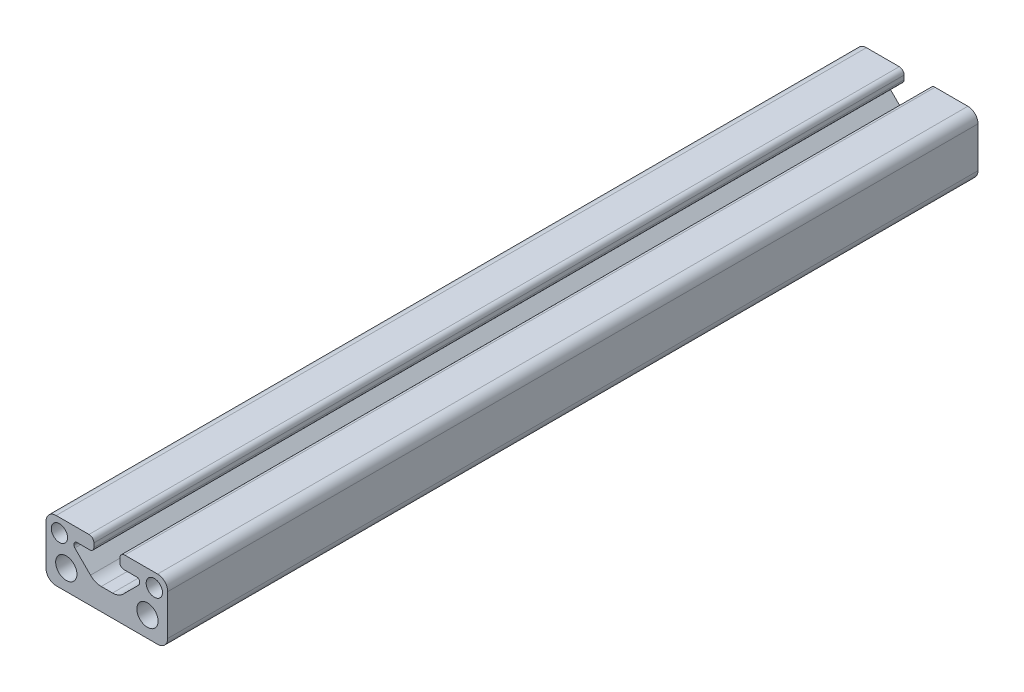
ISO-10303-21;
HEADER;
FILE_DESCRIPTION(('STEP AP214'),'2;1');
FILE_NAME('part.step','',(''),(''),'','','');
FILE_SCHEMA(('AUTOMOTIVE_DESIGN { 1 0 10303 214 1 1 1 1 }'));
ENDSEC;
DATA;
#1=APPLICATION_CONTEXT('core data for automotive mechanical design processes');
#2=APPLICATION_PROTOCOL_DEFINITION('international standard','automotive_design',2000,#1);
#3=PRODUCT_CONTEXT('',#1,'mechanical');
#4=PRODUCT('Part','Part','',(#3));
#5=PRODUCT_RELATED_PRODUCT_CATEGORY('part','',(#4));
#6=PRODUCT_DEFINITION_FORMATION('','',#4);
#7=PRODUCT_DEFINITION_CONTEXT('part definition',#1,'design');
#8=PRODUCT_DEFINITION('design','',#6,#7);
#9=PRODUCT_DEFINITION_SHAPE('','',#8);
#10=(LENGTH_UNIT() NAMED_UNIT(*) SI_UNIT(.MILLI.,.METRE.));
#11=(NAMED_UNIT(*) PLANE_ANGLE_UNIT() SI_UNIT($,.RADIAN.));
#12=(NAMED_UNIT(*) SI_UNIT($,.STERADIAN.) SOLID_ANGLE_UNIT());
#13=UNCERTAINTY_MEASURE_WITH_UNIT(LENGTH_MEASURE(1.E-05),#10,'distance_accuracy_value','');
#14=(GEOMETRIC_REPRESENTATION_CONTEXT(3) GLOBAL_UNCERTAINTY_ASSIGNED_CONTEXT((#13)) GLOBAL_UNIT_ASSIGNED_CONTEXT((#10,
#11,#12)) REPRESENTATION_CONTEXT('',''));
#15=CARTESIAN_POINT('',(0.,0.,0.));
#16=DIRECTION('',(0.,0.,1.));
#17=DIRECTION('',(1.,0.,0.));
#18=AXIS2_PLACEMENT_3D('',#15,#16,#17);
#19=CARTESIAN_POINT('',(-9.39800000000002,4.25536498708179,126.785));
#20=DIRECTION('',(0.,0.,1.));
#21=DIRECTION('',(1.,0.,0.));
#22=AXIS2_PLACEMENT_3D('',#19,#20,#21);
#23=PLANE('',#22);
#24=CARTESIAN_POINT('',(12.7,-3.175,126.785));
#25=DIRECTION('',(0.,0.,1.));
#26=DIRECTION('',(1.,0.,0.));
#27=AXIS2_PLACEMENT_3D('',#24,#25,#26);
#28=CIRCLE('',#27,3.32739999999998);
#29=CARTESIAN_POINT('',(16.0274,-3.175,126.785));
#30=VERTEX_POINT('',#29);
#31=EDGE_CURVE('E498',#30,#30,#28,.T.);
#32=ORIENTED_EDGE('',*,*,#31,.F.);
#33=EDGE_LOOP('',(#32));
#34=FACE_BOUND('',#33,.T.);
#35=CARTESIAN_POINT('',(-14.8487969585205,5.2764327733935,126.785));
#36=DIRECTION('',(0.,0.,1.));
#37=DIRECTION('',(1.,0.,0.));
#38=AXIS2_PLACEMENT_3D('',#35,#36,#37);
#39=CIRCLE('',#38,2.55270000000001);
#40=CARTESIAN_POINT('',(-12.2960969585205,5.2764327733935,126.785));
#41=VERTEX_POINT('',#40);
#42=EDGE_CURVE('E253',#41,#41,#39,.T.);
#43=ORIENTED_EDGE('',*,*,#42,.F.);
#44=EDGE_LOOP('',(#43));
#45=FACE_BOUND('',#44,.T.);
#46=CARTESIAN_POINT('',(-9.39800000000002,4.25536498708179,126.785));
#47=DIRECTION('',(0.,0.,-1.));
#48=DIRECTION('',(1.,0.,0.));
#49=AXIS2_PLACEMENT_3D('',#46,#47,#48);
#50=CIRCLE('',#49,0.888999999999977);
#51=CARTESIAN_POINT('',(-10.0266179284749,3.62674705860696,126.785));
#52=VERTEX_POINT('',#51);
#53=CARTESIAN_POINT('',(-10.287,4.25536498708178,126.785));
#54=VERTEX_POINT('',#53);
#55=EDGE_CURVE('E304',#52,#54,#50,.T.);
#56=ORIENTED_EDGE('',*,*,#55,.T.);
#57=DIRECTION('',(0.,1.,0.));
#58=VECTOR('',#57,1.);
#59=CARTESIAN_POINT('',(-10.287,4.25536498708178,126.785));
#60=LINE('',#59,#58);
#61=CARTESIAN_POINT('',(-10.287,4.5719999999999,126.785));
#62=VERTEX_POINT('',#61);
#63=EDGE_CURVE('E152',#54,#62,#60,.T.);
#64=ORIENTED_EDGE('',*,*,#63,.T.);
#65=CARTESIAN_POINT('',(-9.398,4.5719999999999,126.785));
#66=DIRECTION('',(0.,0.,-1.));
#67=DIRECTION('',(1.,0.,0.));
#68=AXIS2_PLACEMENT_3D('',#65,#66,#67);
#69=CIRCLE('',#68,0.888999999999999);
#70=CARTESIAN_POINT('',(-9.398,5.4609999999999,126.785));
#71=VERTEX_POINT('',#70);
#72=EDGE_CURVE('E379',#62,#71,#69,.T.);
#73=ORIENTED_EDGE('',*,*,#72,.T.);
#74=DIRECTION('',(1.,0.,0.));
#75=VECTOR('',#74,1.);
#76=CARTESIAN_POINT('',(-9.398,5.4609999999999,126.785));
#77=LINE('',#76,#75);
#78=CARTESIAN_POINT('',(-5.334,5.4609999999999,126.785));
#79=VERTEX_POINT('',#78);
#80=EDGE_CURVE('E398',#71,#79,#77,.T.);
#81=ORIENTED_EDGE('',*,*,#80,.T.);
#82=CARTESIAN_POINT('',(-5.334,6.7309999999999,126.785));
#83=DIRECTION('',(0.,0.,1.));
#84=DIRECTION('',(1.,0.,0.));
#85=AXIS2_PLACEMENT_3D('',#82,#83,#84);
#86=CIRCLE('',#85,1.27);
#87=CARTESIAN_POINT('',(-4.064,6.7309999999999,126.785));
#88=VERTEX_POINT('',#87);
#89=EDGE_CURVE('E395',#79,#88,#86,.T.);
#90=ORIENTED_EDGE('',*,*,#89,.T.);
#91=DIRECTION('',(0.,1.,0.));
#92=VECTOR('',#91,1.);
#93=CARTESIAN_POINT('',(-4.064,6.7309999999999,126.785));
#94=LINE('',#93,#92);
#95=CARTESIAN_POINT('',(-4.06399999999996,8.00099999999999,126.785));
#96=VERTEX_POINT('',#95);
#97=EDGE_CURVE('E397',#88,#96,#94,.T.);
#98=ORIENTED_EDGE('',*,*,#97,.T.);
#99=CARTESIAN_POINT('',(-5.58799999999999,8.00099999999999,126.785));
#100=DIRECTION('',(0.,0.,1.));
#101=DIRECTION('',(1.,0.,0.));
#102=AXIS2_PLACEMENT_3D('',#99,#100,#101);
#103=CIRCLE('',#102,1.52400000000005);
#104=CARTESIAN_POINT('',(-5.58799999999999,9.52500000000004,126.785));
#105=VERTEX_POINT('',#104);
#106=EDGE_CURVE('E400',#96,#105,#103,.T.);
#107=ORIENTED_EDGE('',*,*,#106,.T.);
#108=DIRECTION('',(-1.,0.,0.));
#109=VECTOR('',#108,1.);
#110=CARTESIAN_POINT('',(-5.58799999999999,9.52500000000006,126.785));
#111=LINE('',#110,#109);
#112=CARTESIAN_POINT('',(-15.875,9.52499999999998,126.785));
#113=VERTEX_POINT('',#112);
#114=EDGE_CURVE('E406',#105,#113,#111,.T.);
#115=ORIENTED_EDGE('',*,*,#114,.T.);
#116=CARTESIAN_POINT('',(-15.875,6.34999999999999,126.785));
#117=DIRECTION('',(0.,0.,1.));
#118=DIRECTION('',(1.,0.,0.));
#119=AXIS2_PLACEMENT_3D('',#116,#117,#118);
#120=CIRCLE('',#119,3.175);
#121=CARTESIAN_POINT('',(-19.05,6.34999999999999,126.785));
#122=VERTEX_POINT('',#121);
#123=EDGE_CURVE('E408',#113,#122,#120,.T.);
#124=ORIENTED_EDGE('',*,*,#123,.T.);
#125=DIRECTION('',(0.,-1.,0.));
#126=VECTOR('',#125,1.);
#127=CARTESIAN_POINT('',(-19.05,6.34999999999999,126.785));
#128=LINE('',#127,#126);
#129=CARTESIAN_POINT('',(-19.05,-6.35000000000002,126.785));
#130=VERTEX_POINT('',#129);
#131=EDGE_CURVE('E410',#122,#130,#128,.T.);
#132=ORIENTED_EDGE('',*,*,#131,.T.);
#133=CARTESIAN_POINT('',(-15.875,-6.35000000000002,126.785));
#134=DIRECTION('',(0.,0.,1.));
#135=DIRECTION('',(1.,0.,0.));
#136=AXIS2_PLACEMENT_3D('',#133,#134,#135);
#137=CIRCLE('',#136,3.175);
#138=CARTESIAN_POINT('',(-15.875,-9.52500000000001,126.785));
#139=VERTEX_POINT('',#138);
#140=EDGE_CURVE('E412',#130,#139,#137,.T.);
#141=ORIENTED_EDGE('',*,*,#140,.T.);
#142=DIRECTION('',(1.,0.,0.));
#143=VECTOR('',#142,1.);
#144=CARTESIAN_POINT('',(-15.875,-9.52500000000001,126.785));
#145=LINE('',#144,#143);
#146=CARTESIAN_POINT('',(15.875,-9.52500000000002,126.785));
#147=VERTEX_POINT('',#146);
#148=EDGE_CURVE('E414',#139,#147,#145,.T.);
#149=ORIENTED_EDGE('',*,*,#148,.T.);
#150=CARTESIAN_POINT('',(15.875,-6.35000000000002,126.785));
#151=DIRECTION('',(0.,0.,1.));
#152=DIRECTION('',(1.,0.,0.));
#153=AXIS2_PLACEMENT_3D('',#150,#151,#152);
#154=CIRCLE('',#153,3.175);
#155=CARTESIAN_POINT('',(19.05,-6.35000000000002,126.785));
#156=VERTEX_POINT('',#155);
#157=EDGE_CURVE('E416',#147,#156,#154,.T.);
#158=ORIENTED_EDGE('',*,*,#157,.T.);
#159=DIRECTION('',(0.,1.,0.));
#160=VECTOR('',#159,1.);
#161=CARTESIAN_POINT('',(19.05,-6.35000000000002,126.785));
#162=LINE('',#161,#160);
#163=CARTESIAN_POINT('',(19.05,6.34999999999998,126.785));
#164=VERTEX_POINT('',#163);
#165=EDGE_CURVE('E418',#156,#164,#162,.T.);
#166=ORIENTED_EDGE('',*,*,#165,.T.);
#167=CARTESIAN_POINT('',(15.875,6.34999999999998,126.785));
#168=DIRECTION('',(0.,0.,1.));
#169=DIRECTION('',(1.,0.,0.));
#170=AXIS2_PLACEMENT_3D('',#167,#168,#169);
#171=CIRCLE('',#170,3.175);
#172=CARTESIAN_POINT('',(15.875,9.52499999999999,126.785));
#173=VERTEX_POINT('',#172);
#174=EDGE_CURVE('E420',#164,#173,#171,.T.);
#175=ORIENTED_EDGE('',*,*,#174,.T.);
#176=DIRECTION('',(-1.,0.,0.));
#177=VECTOR('',#176,1.);
#178=CARTESIAN_POINT('',(15.875,9.52499999999999,126.785));
#179=LINE('',#178,#177);
#180=CARTESIAN_POINT('',(5.58799999999998,9.52499999999999,126.785));
#181=VERTEX_POINT('',#180);
#182=EDGE_CURVE('E422',#173,#181,#179,.T.);
#183=ORIENTED_EDGE('',*,*,#182,.T.);
#184=CARTESIAN_POINT('',(5.58799999999998,8.00100000000001,126.785));
#185=DIRECTION('',(0.,0.,1.));
#186=DIRECTION('',(1.,0.,0.));
#187=AXIS2_PLACEMENT_3D('',#184,#185,#186);
#188=CIRCLE('',#187,1.52399999999998);
#189=CARTESIAN_POINT('',(4.064,8.00100000000001,126.785));
#190=VERTEX_POINT('',#189);
#191=EDGE_CURVE('E424',#181,#190,#188,.T.);
#192=ORIENTED_EDGE('',*,*,#191,.T.);
#193=DIRECTION('',(0.,-1.,0.));
#194=VECTOR('',#193,1.);
#195=CARTESIAN_POINT('',(4.064,8.00100000000001,126.785));
#196=LINE('',#195,#194);
#197=CARTESIAN_POINT('',(4.064,6.73099999999988,126.785));
#198=VERTEX_POINT('',#197);
#199=EDGE_CURVE('E426',#190,#198,#196,.T.);
#200=ORIENTED_EDGE('',*,*,#199,.T.);
#201=CARTESIAN_POINT('',(5.33399999999998,6.73099999999988,126.785));
#202=DIRECTION('',(0.,0.,1.));
#203=DIRECTION('',(1.,0.,0.));
#204=AXIS2_PLACEMENT_3D('',#201,#202,#203);
#205=CIRCLE('',#204,1.26999999999998);
#206=CARTESIAN_POINT('',(5.33399999999998,5.4609999999999,126.785));
#207=VERTEX_POINT('',#206);
#208=EDGE_CURVE('E428',#198,#207,#205,.T.);
#209=ORIENTED_EDGE('',*,*,#208,.T.);
#210=DIRECTION('',(1.,0.,0.));
#211=VECTOR('',#210,1.);
#212=CARTESIAN_POINT('',(5.33399999999998,5.4609999999999,126.785));
#213=LINE('',#212,#211);
#214=CARTESIAN_POINT('',(9.398,5.4609999999999,126.785));
#215=VERTEX_POINT('',#214);
#216=EDGE_CURVE('E430',#207,#215,#213,.T.);
#217=ORIENTED_EDGE('',*,*,#216,.T.);
#218=CARTESIAN_POINT('',(9.398,4.5719999999999,126.785));
#219=DIRECTION('',(0.,0.,-1.));
#220=DIRECTION('',(1.,0.,0.));
#221=AXIS2_PLACEMENT_3D('',#218,#219,#220);
#222=CIRCLE('',#221,0.888999999999999);
#223=CARTESIAN_POINT('',(10.287,4.5719999999999,126.785));
#224=VERTEX_POINT('',#223);
#225=EDGE_CURVE('E432',#215,#224,#222,.T.);
#226=ORIENTED_EDGE('',*,*,#225,.T.);
#227=DIRECTION('',(0.,-1.,0.));
#228=VECTOR('',#227,1.);
#229=CARTESIAN_POINT('',(10.287,4.5719999999999,126.785));
#230=LINE('',#229,#228);
#231=CARTESIAN_POINT('',(10.287,4.25536498708178,126.785));
#232=VERTEX_POINT('',#231);
#233=EDGE_CURVE('E434',#224,#232,#230,.T.);
#234=ORIENTED_EDGE('',*,*,#233,.T.);
#235=CARTESIAN_POINT('',(9.39800000000002,4.25536498708179,126.785));
#236=DIRECTION('',(0.,0.,-1.));
#237=DIRECTION('',(1.,0.,0.));
#238=AXIS2_PLACEMENT_3D('',#235,#236,#237);
#239=CIRCLE('',#238,0.888999999999977);
#240=CARTESIAN_POINT('',(10.0266179284748,3.62674705860696,126.785));
#241=VERTEX_POINT('',#240);
#242=EDGE_CURVE('E436',#232,#241,#239,.T.);
#243=ORIENTED_EDGE('',*,*,#242,.T.);
#244=DIRECTION('',(-0.707106781186548,-0.707106781186548,0.));
#245=VECTOR('',#244,1.);
#246=CARTESIAN_POINT('',(10.0266179284748,3.62674705860696,126.785));
#247=LINE('',#246,#245);
#248=CARTESIAN_POINT('',(5.12405508058801,-1.27581578927987,126.785));
#249=VERTEX_POINT('',#248);
#250=EDGE_CURVE('E438',#241,#249,#247,.T.);
#251=ORIENTED_EDGE('',*,*,#250,.T.);
#252=CARTESIAN_POINT('',(1.76543929130814,2.0828,126.785));
#253=DIRECTION('',(0.,0.,-1.));
#254=DIRECTION('',(1.,0.,0.));
#255=AXIS2_PLACEMENT_3D('',#252,#253,#254);
#256=CIRCLE('',#255,4.74980000000002);
#257=CARTESIAN_POINT('',(1.76543929130813,-2.66700000000002,126.785));
#258=VERTEX_POINT('',#257);
#259=EDGE_CURVE('E231',#249,#258,#256,.T.);
#260=ORIENTED_EDGE('',*,*,#259,.T.);
#261=DIRECTION('',(-1.,0.,0.));
#262=VECTOR('',#261,1.);
#263=CARTESIAN_POINT('',(1.76543929130814,-2.66700000000002,126.785));
#264=LINE('',#263,#262);
#265=CARTESIAN_POINT('',(-1.76543929130814,-2.66700000000002,126.785));
#266=VERTEX_POINT('',#265);
#267=EDGE_CURVE('E225',#258,#266,#264,.T.);
#268=ORIENTED_EDGE('',*,*,#267,.T.);
#269=CARTESIAN_POINT('',(-1.76543929130814,2.0828,126.785));
#270=DIRECTION('',(0.,0.,-1.));
#271=DIRECTION('',(1.,0.,0.));
#272=AXIS2_PLACEMENT_3D('',#269,#270,#271);
#273=CIRCLE('',#272,4.74980000000002);
#274=CARTESIAN_POINT('',(-5.12405508058801,-1.27581578927987,126.785));
#275=VERTEX_POINT('',#274);
#276=EDGE_CURVE('E229',#266,#275,#273,.T.);
#277=ORIENTED_EDGE('',*,*,#276,.T.);
#278=DIRECTION('',(-0.707106781186548,0.707106781186547,0.));
#279=VECTOR('',#278,1.);
#280=CARTESIAN_POINT('',(-5.12405508058801,-1.27581578927987,126.785));
#281=LINE('',#280,#279);
#282=EDGE_CURVE('E49',#275,#52,#281,.T.);
#283=ORIENTED_EDGE('',*,*,#282,.T.);
#284=EDGE_LOOP('',(#56,#64,#73,#81,#90,#98,#107,#115,#124,#132,#141,#149,#158,#166,#175,#183,
#192,#200,#209,#217,#226,#234,#243,#251,#260,#268,#277,#283));
#285=FACE_BOUND('',#284,.T.);
#286=CARTESIAN_POINT('',(-12.7,-3.175,126.785));
#287=DIRECTION('',(0.,0.,1.));
#288=DIRECTION('',(1.,0.,0.));
#289=AXIS2_PLACEMENT_3D('',#286,#287,#288);
#290=CIRCLE('',#289,3.3274);
#291=CARTESIAN_POINT('',(-9.37260000000001,-3.175,126.785));
#292=VERTEX_POINT('',#291);
#293=EDGE_CURVE('E504',#292,#292,#290,.T.);
#294=ORIENTED_EDGE('',*,*,#293,.F.);
#295=EDGE_LOOP('',(#294));
#296=FACE_BOUND('',#295,.T.);
#297=CARTESIAN_POINT('',(14.8487969585206,5.27643277339342,126.785));
#298=DIRECTION('',(0.,0.,1.));
#299=DIRECTION('',(1.,0.,0.));
#300=AXIS2_PLACEMENT_3D('',#297,#298,#299);
#301=CIRCLE('',#300,2.55270000000001);
#302=CARTESIAN_POINT('',(17.4014969585206,5.27643277339342,126.785));
#303=VERTEX_POINT('',#302);
#304=EDGE_CURVE('E489',#303,#303,#301,.T.);
#305=ORIENTED_EDGE('',*,*,#304,.F.);
#306=EDGE_LOOP('',(#305));
#307=FACE_BOUND('',#306,.T.);
#308=ADVANCED_FACE('F32',(#34,#45,#285,#296,#307),#23,.T.);
#309=CARTESIAN_POINT('',(-9.39800000000002,4.25536498708179,-126.785));
#310=DIRECTION('',(0.,0.,1.));
#311=DIRECTION('',(1.,0.,0.));
#312=AXIS2_PLACEMENT_3D('',#309,#310,#311);
#313=PLANE('',#312);
#314=CARTESIAN_POINT('',(-9.39800000000002,4.25536498708179,-126.785));
#315=DIRECTION('',(0.,0.,-1.));
#316=DIRECTION('',(1.,0.,0.));
#317=AXIS2_PLACEMENT_3D('',#314,#315,#316);
#318=CIRCLE('',#317,0.888999999999977);
#319=CARTESIAN_POINT('',(-10.0266179284749,3.62674705860696,-126.785));
#320=VERTEX_POINT('',#319);
#321=CARTESIAN_POINT('',(-10.287,4.25536498708178,-126.785));
#322=VERTEX_POINT('',#321);
#323=EDGE_CURVE('E249',#320,#322,#318,.T.);
#324=ORIENTED_EDGE('',*,*,#323,.F.);
#325=DIRECTION('',(-0.707106781186548,0.707106781186547,0.));
#326=VECTOR('',#325,1.);
#327=CARTESIAN_POINT('',(-5.12405508058801,-1.27581578927987,-126.785));
#328=LINE('',#327,#326);
#329=CARTESIAN_POINT('',(-5.12405508058801,-1.27581578927987,-126.785));
#330=VERTEX_POINT('',#329);
#331=EDGE_CURVE('E144',#330,#320,#328,.T.);
#332=ORIENTED_EDGE('',*,*,#331,.F.);
#333=CARTESIAN_POINT('',(-1.76543929130814,2.0828,-126.785));
#334=DIRECTION('',(0.,0.,-1.));
#335=DIRECTION('',(1.,0.,0.));
#336=AXIS2_PLACEMENT_3D('',#333,#334,#335);
#337=CIRCLE('',#336,4.74980000000002);
#338=CARTESIAN_POINT('',(-1.76543929130814,-2.66700000000002,-126.785));
#339=VERTEX_POINT('',#338);
#340=EDGE_CURVE('E138',#339,#330,#337,.T.);
#341=ORIENTED_EDGE('',*,*,#340,.F.);
#342=DIRECTION('',(-1.,0.,0.));
#343=VECTOR('',#342,1.);
#344=CARTESIAN_POINT('',(1.76543929130814,-2.66700000000002,-126.785));
#345=LINE('',#344,#343);
#346=CARTESIAN_POINT('',(1.76543929130813,-2.66700000000002,-126.785));
#347=VERTEX_POINT('',#346);
#348=EDGE_CURVE('E239',#347,#339,#345,.T.);
#349=ORIENTED_EDGE('',*,*,#348,.F.);
#350=CARTESIAN_POINT('',(1.76543929130814,2.0828,-126.785));
#351=DIRECTION('',(0.,0.,-1.));
#352=DIRECTION('',(1.,0.,0.));
#353=AXIS2_PLACEMENT_3D('',#350,#351,#352);
#354=CIRCLE('',#353,4.74980000000002);
#355=CARTESIAN_POINT('',(5.12405508058801,-1.27581578927987,-126.785));
#356=VERTEX_POINT('',#355);
#357=EDGE_CURVE('E299',#356,#347,#354,.T.);
#358=ORIENTED_EDGE('',*,*,#357,.F.);
#359=DIRECTION('',(-0.707106781186548,-0.707106781186548,0.));
#360=VECTOR('',#359,1.);
#361=CARTESIAN_POINT('',(10.0266179284748,3.62674705860696,-126.785));
#362=LINE('',#361,#360);
#363=CARTESIAN_POINT('',(10.0266179284748,3.62674705860696,-126.785));
#364=VERTEX_POINT('',#363);
#365=EDGE_CURVE('E297',#364,#356,#362,.T.);
#366=ORIENTED_EDGE('',*,*,#365,.F.);
#367=CARTESIAN_POINT('',(9.39800000000002,4.25536498708179,-126.785));
#368=DIRECTION('',(0.,0.,-1.));
#369=DIRECTION('',(1.,0.,0.));
#370=AXIS2_PLACEMENT_3D('',#367,#368,#369);
#371=CIRCLE('',#370,0.888999999999977);
#372=CARTESIAN_POINT('',(10.287,4.25536498708178,-126.785));
#373=VERTEX_POINT('',#372);
#374=EDGE_CURVE('E295',#373,#364,#371,.T.);
#375=ORIENTED_EDGE('',*,*,#374,.F.);
#376=DIRECTION('',(0.,-1.,0.));
#377=VECTOR('',#376,1.);
#378=CARTESIAN_POINT('',(10.287,4.5719999999999,-126.785));
#379=LINE('',#378,#377);
#380=CARTESIAN_POINT('',(10.287,4.5719999999999,-126.785));
#381=VERTEX_POINT('',#380);
#382=EDGE_CURVE('E293',#381,#373,#379,.T.);
#383=ORIENTED_EDGE('',*,*,#382,.F.);
#384=CARTESIAN_POINT('',(9.398,4.5719999999999,-126.785));
#385=DIRECTION('',(0.,0.,-1.));
#386=DIRECTION('',(1.,0.,0.));
#387=AXIS2_PLACEMENT_3D('',#384,#385,#386);
#388=CIRCLE('',#387,0.888999999999999);
#389=CARTESIAN_POINT('',(9.398,5.4609999999999,-126.785));
#390=VERTEX_POINT('',#389);
#391=EDGE_CURVE('E291',#390,#381,#388,.T.);
#392=ORIENTED_EDGE('',*,*,#391,.F.);
#393=DIRECTION('',(1.,0.,0.));
#394=VECTOR('',#393,1.);
#395=CARTESIAN_POINT('',(5.33399999999998,5.4609999999999,-126.785));
#396=LINE('',#395,#394);
#397=CARTESIAN_POINT('',(5.33399999999998,5.4609999999999,-126.785));
#398=VERTEX_POINT('',#397);
#399=EDGE_CURVE('E289',#398,#390,#396,.T.);
#400=ORIENTED_EDGE('',*,*,#399,.F.);
#401=CARTESIAN_POINT('',(5.33399999999998,6.73099999999988,-126.785));
#402=DIRECTION('',(0.,0.,1.));
#403=DIRECTION('',(1.,0.,0.));
#404=AXIS2_PLACEMENT_3D('',#401,#402,#403);
#405=CIRCLE('',#404,1.26999999999998);
#406=CARTESIAN_POINT('',(4.064,6.73099999999988,-126.785));
#407=VERTEX_POINT('',#406);
#408=EDGE_CURVE('E287',#407,#398,#405,.T.);
#409=ORIENTED_EDGE('',*,*,#408,.F.);
#410=DIRECTION('',(0.,-1.,0.));
#411=VECTOR('',#410,1.);
#412=CARTESIAN_POINT('',(4.064,8.00100000000001,-126.785));
#413=LINE('',#412,#411);
#414=CARTESIAN_POINT('',(4.064,8.00100000000001,-126.785));
#415=VERTEX_POINT('',#414);
#416=EDGE_CURVE('E285',#415,#407,#413,.T.);
#417=ORIENTED_EDGE('',*,*,#416,.F.);
#418=CARTESIAN_POINT('',(5.58799999999998,8.00100000000001,-126.785));
#419=DIRECTION('',(0.,0.,1.));
#420=DIRECTION('',(1.,0.,0.));
#421=AXIS2_PLACEMENT_3D('',#418,#419,#420);
#422=CIRCLE('',#421,1.52399999999998);
#423=CARTESIAN_POINT('',(5.58799999999998,9.52499999999999,-126.785));
#424=VERTEX_POINT('',#423);
#425=EDGE_CURVE('E283',#424,#415,#422,.T.);
#426=ORIENTED_EDGE('',*,*,#425,.F.);
#427=DIRECTION('',(-1.,0.,0.));
#428=VECTOR('',#427,1.);
#429=CARTESIAN_POINT('',(15.875,9.52499999999999,-126.785));
#430=LINE('',#429,#428);
#431=CARTESIAN_POINT('',(15.875,9.52499999999999,-126.785));
#432=VERTEX_POINT('',#431);
#433=EDGE_CURVE('E281',#432,#424,#430,.T.);
#434=ORIENTED_EDGE('',*,*,#433,.F.);
#435=CARTESIAN_POINT('',(15.875,6.34999999999998,-126.785));
#436=DIRECTION('',(0.,0.,1.));
#437=DIRECTION('',(1.,0.,0.));
#438=AXIS2_PLACEMENT_3D('',#435,#436,#437);
#439=CIRCLE('',#438,3.175);
#440=CARTESIAN_POINT('',(19.05,6.34999999999998,-126.785));
#441=VERTEX_POINT('',#440);
#442=EDGE_CURVE('E279',#441,#432,#439,.T.);
#443=ORIENTED_EDGE('',*,*,#442,.F.);
#444=DIRECTION('',(0.,1.,0.));
#445=VECTOR('',#444,1.);
#446=CARTESIAN_POINT('',(19.05,-6.35000000000002,-126.785));
#447=LINE('',#446,#445);
#448=CARTESIAN_POINT('',(19.05,-6.35000000000002,-126.785));
#449=VERTEX_POINT('',#448);
#450=EDGE_CURVE('E277',#449,#441,#447,.T.);
#451=ORIENTED_EDGE('',*,*,#450,.F.);
#452=CARTESIAN_POINT('',(15.875,-6.35000000000002,-126.785));
#453=DIRECTION('',(0.,0.,1.));
#454=DIRECTION('',(1.,0.,0.));
#455=AXIS2_PLACEMENT_3D('',#452,#453,#454);
#456=CIRCLE('',#455,3.175);
#457=CARTESIAN_POINT('',(15.875,-9.52500000000002,-126.785));
#458=VERTEX_POINT('',#457);
#459=EDGE_CURVE('E275',#458,#449,#456,.T.);
#460=ORIENTED_EDGE('',*,*,#459,.F.);
#461=DIRECTION('',(1.,0.,0.));
#462=VECTOR('',#461,1.);
#463=CARTESIAN_POINT('',(-15.875,-9.52500000000001,-126.785));
#464=LINE('',#463,#462);
#465=CARTESIAN_POINT('',(-15.875,-9.52500000000001,-126.785));
#466=VERTEX_POINT('',#465);
#467=EDGE_CURVE('E273',#466,#458,#464,.T.);
#468=ORIENTED_EDGE('',*,*,#467,.F.);
#469=CARTESIAN_POINT('',(-15.875,-6.35000000000002,-126.785));
#470=DIRECTION('',(0.,0.,1.));
#471=DIRECTION('',(1.,0.,0.));
#472=AXIS2_PLACEMENT_3D('',#469,#470,#471);
#473=CIRCLE('',#472,3.175);
#474=CARTESIAN_POINT('',(-19.05,-6.35000000000002,-126.785));
#475=VERTEX_POINT('',#474);
#476=EDGE_CURVE('E271',#475,#466,#473,.T.);
#477=ORIENTED_EDGE('',*,*,#476,.F.);
#478=DIRECTION('',(0.,-1.,0.));
#479=VECTOR('',#478,1.);
#480=CARTESIAN_POINT('',(-19.05,6.34999999999999,-126.785));
#481=LINE('',#480,#479);
#482=CARTESIAN_POINT('',(-19.05,6.34999999999999,-126.785));
#483=VERTEX_POINT('',#482);
#484=EDGE_CURVE('E269',#483,#475,#481,.T.);
#485=ORIENTED_EDGE('',*,*,#484,.F.);
#486=CARTESIAN_POINT('',(-15.875,6.34999999999999,-126.785));
#487=DIRECTION('',(0.,0.,1.));
#488=DIRECTION('',(1.,0.,0.));
#489=AXIS2_PLACEMENT_3D('',#486,#487,#488);
#490=CIRCLE('',#489,3.175);
#491=CARTESIAN_POINT('',(-15.875,9.52499999999998,-126.785));
#492=VERTEX_POINT('',#491);
#493=EDGE_CURVE('E267',#492,#483,#490,.T.);
#494=ORIENTED_EDGE('',*,*,#493,.F.);
#495=DIRECTION('',(-1.,0.,0.));
#496=VECTOR('',#495,1.);
#497=CARTESIAN_POINT('',(-5.58799999999999,9.52500000000006,-126.785));
#498=LINE('',#497,#496);
#499=CARTESIAN_POINT('',(-5.58799999999999,9.52500000000004,-126.785));
#500=VERTEX_POINT('',#499);
#501=EDGE_CURVE('E265',#500,#492,#498,.T.);
#502=ORIENTED_EDGE('',*,*,#501,.F.);
#503=CARTESIAN_POINT('',(-5.58799999999999,8.00099999999999,-126.785));
#504=DIRECTION('',(0.,0.,1.));
#505=DIRECTION('',(1.,0.,0.));
#506=AXIS2_PLACEMENT_3D('',#503,#504,#505);
#507=CIRCLE('',#506,1.52400000000005);
#508=CARTESIAN_POINT('',(-4.06399999999996,8.00099999999999,-126.785));
#509=VERTEX_POINT('',#508);
#510=EDGE_CURVE('E263',#509,#500,#507,.T.);
#511=ORIENTED_EDGE('',*,*,#510,.F.);
#512=DIRECTION('',(0.,1.,0.));
#513=VECTOR('',#512,1.);
#514=CARTESIAN_POINT('',(-4.064,6.7309999999999,-126.785));
#515=LINE('',#514,#513);
#516=CARTESIAN_POINT('',(-4.064,6.7309999999999,-126.785));
#517=VERTEX_POINT('',#516);
#518=EDGE_CURVE('E261',#517,#509,#515,.T.);
#519=ORIENTED_EDGE('',*,*,#518,.F.);
#520=CARTESIAN_POINT('',(-5.334,6.7309999999999,-126.785));
#521=DIRECTION('',(0.,0.,1.));
#522=DIRECTION('',(1.,0.,0.));
#523=AXIS2_PLACEMENT_3D('',#520,#521,#522);
#524=CIRCLE('',#523,1.27);
#525=CARTESIAN_POINT('',(-5.334,5.4609999999999,-126.785));
#526=VERTEX_POINT('',#525);
#527=EDGE_CURVE('E259',#526,#517,#524,.T.);
#528=ORIENTED_EDGE('',*,*,#527,.F.);
#529=DIRECTION('',(1.,0.,0.));
#530=VECTOR('',#529,1.);
#531=CARTESIAN_POINT('',(-9.398,5.4609999999999,-126.785));
#532=LINE('',#531,#530);
#533=CARTESIAN_POINT('',(-9.398,5.4609999999999,-126.785));
#534=VERTEX_POINT('',#533);
#535=EDGE_CURVE('E257',#534,#526,#532,.T.);
#536=ORIENTED_EDGE('',*,*,#535,.F.);
#537=CARTESIAN_POINT('',(-9.398,4.5719999999999,-126.785));
#538=DIRECTION('',(0.,0.,-1.));
#539=DIRECTION('',(1.,0.,0.));
#540=AXIS2_PLACEMENT_3D('',#537,#538,#539);
#541=CIRCLE('',#540,0.888999999999999);
#542=CARTESIAN_POINT('',(-10.287,4.5719999999999,-126.785));
#543=VERTEX_POINT('',#542);
#544=EDGE_CURVE('E255',#543,#534,#541,.T.);
#545=ORIENTED_EDGE('',*,*,#544,.F.);
#546=DIRECTION('',(0.,1.,0.));
#547=VECTOR('',#546,1.);
#548=CARTESIAN_POINT('',(-10.287,4.25536498708178,-126.785));
#549=LINE('',#548,#547);
#550=EDGE_CURVE('E252',#322,#543,#549,.T.);
#551=ORIENTED_EDGE('',*,*,#550,.F.);
#552=EDGE_LOOP('',(#324,#332,#341,#349,#358,#366,#375,#383,#392,#400,#409,#417,#426,#434,#443,
#451,#460,#468,#477,#485,#494,#502,#511,#519,#528,#536,#545,#551));
#553=FACE_BOUND('',#552,.T.);
#554=CARTESIAN_POINT('',(-14.8487969585205,5.2764327733935,-126.785));
#555=DIRECTION('',(0.,0.,1.));
#556=DIRECTION('',(1.,0.,0.));
#557=AXIS2_PLACEMENT_3D('',#554,#555,#556);
#558=CIRCLE('',#557,2.55270000000001);
#559=CARTESIAN_POINT('',(-12.2960969585205,5.2764327733935,-126.785));
#560=VERTEX_POINT('',#559);
#561=EDGE_CURVE('E507',#560,#560,#558,.T.);
#562=ORIENTED_EDGE('',*,*,#561,.T.);
#563=EDGE_LOOP('',(#562));
#564=FACE_BOUND('',#563,.T.);
#565=CARTESIAN_POINT('',(-12.7,-3.175,-126.785));
#566=DIRECTION('',(0.,0.,1.));
#567=DIRECTION('',(1.,0.,0.));
#568=AXIS2_PLACEMENT_3D('',#565,#566,#567);
#569=CIRCLE('',#568,3.3274);
#570=CARTESIAN_POINT('',(-9.37260000000001,-3.175,-126.785));
#571=VERTEX_POINT('',#570);
#572=EDGE_CURVE('E501',#571,#571,#569,.T.);
#573=ORIENTED_EDGE('',*,*,#572,.T.);
#574=EDGE_LOOP('',(#573));
#575=FACE_BOUND('',#574,.T.);
#576=CARTESIAN_POINT('',(12.7,-3.175,-126.785));
#577=DIRECTION('',(0.,0.,1.));
#578=DIRECTION('',(1.,0.,0.));
#579=AXIS2_PLACEMENT_3D('',#576,#577,#578);
#580=CIRCLE('',#579,3.32739999999998);
#581=CARTESIAN_POINT('',(16.0274,-3.175,-126.785));
#582=VERTEX_POINT('',#581);
#583=EDGE_CURVE('E495',#582,#582,#580,.T.);
#584=ORIENTED_EDGE('',*,*,#583,.T.);
#585=EDGE_LOOP('',(#584));
#586=FACE_BOUND('',#585,.T.);
#587=CARTESIAN_POINT('',(14.8487969585206,5.27643277339342,-126.785));
#588=DIRECTION('',(0.,0.,1.));
#589=DIRECTION('',(1.,0.,0.));
#590=AXIS2_PLACEMENT_3D('',#587,#588,#589);
#591=CIRCLE('',#590,2.55270000000001);
#592=CARTESIAN_POINT('',(17.4014969585206,5.27643277339342,-126.785));
#593=VERTEX_POINT('',#592);
#594=EDGE_CURVE('E492',#593,#593,#591,.T.);
#595=ORIENTED_EDGE('',*,*,#594,.T.);
#596=EDGE_LOOP('',(#595));
#597=FACE_BOUND('',#596,.T.);
#598=ADVANCED_FACE('F383',(#553,#564,#575,#586,#597),#313,.F.);
#599=CARTESIAN_POINT('',(-9.39800000000002,4.25536498708179,126.785));
#600=DIRECTION('',(0.,0.,-1.));
#601=DIRECTION('',(-1.,0.,0.));
#602=AXIS2_PLACEMENT_3D('',#599,#600,#601);
#603=CYLINDRICAL_SURFACE('',#602,0.888999999999977);
#604=ORIENTED_EDGE('',*,*,#323,.T.);
#605=DIRECTION('',(0.,0.,-1.));
#606=VECTOR('',#605,1.);
#607=CARTESIAN_POINT('',(-10.287,4.25536498708178,126.785));
#608=LINE('',#607,#606);
#609=EDGE_CURVE('E11',#54,#322,#608,.T.);
#610=ORIENTED_EDGE('',*,*,#609,.F.);
#611=ORIENTED_EDGE('',*,*,#55,.F.);
#612=DIRECTION('',(0.,0.,-1.));
#613=VECTOR('',#612,1.);
#614=CARTESIAN_POINT('',(-10.0266179284749,3.62674705860696,126.785));
#615=LINE('',#614,#613);
#616=EDGE_CURVE('E245',#52,#320,#615,.T.);
#617=ORIENTED_EDGE('',*,*,#616,.T.);
#618=EDGE_LOOP('',(#604,#610,#611,#617));
#619=FACE_BOUND('',#618,.T.);
#620=ADVANCED_FACE('F34',(#619),#603,.F.);
#621=CARTESIAN_POINT('',(-10.287,4.25536498708178,126.785));
#622=DIRECTION('',(-1.,0.,0.));
#623=DIRECTION('',(0.,0.,1.));
#624=AXIS2_PLACEMENT_3D('',#621,#622,#623);
#625=PLANE('',#624);
#626=ORIENTED_EDGE('',*,*,#550,.T.);
#627=DIRECTION('',(0.,0.,-1.));
#628=VECTOR('',#627,1.);
#629=CARTESIAN_POINT('',(-10.287,4.5719999999999,126.785));
#630=LINE('',#629,#628);
#631=EDGE_CURVE('E41',#62,#543,#630,.T.);
#632=ORIENTED_EDGE('',*,*,#631,.F.);
#633=ORIENTED_EDGE('',*,*,#63,.F.);
#634=ORIENTED_EDGE('',*,*,#609,.T.);
#635=EDGE_LOOP('',(#626,#632,#633,#634));
#636=FACE_BOUND('',#635,.T.);
#637=ADVANCED_FACE('F777',(#636),#625,.F.);
#638=CARTESIAN_POINT('',(-9.398,4.5719999999999,126.785));
#639=DIRECTION('',(0.,0.,-1.));
#640=DIRECTION('',(-1.,0.,0.));
#641=AXIS2_PLACEMENT_3D('',#638,#639,#640);
#642=CYLINDRICAL_SURFACE('',#641,0.888999999999999);
#643=ORIENTED_EDGE('',*,*,#544,.T.);
#644=DIRECTION('',(0.,0.,-1.));
#645=VECTOR('',#644,1.);
#646=CARTESIAN_POINT('',(-9.398,5.4609999999999,126.785));
#647=LINE('',#646,#645);
#648=EDGE_CURVE('E371',#71,#534,#647,.T.);
#649=ORIENTED_EDGE('',*,*,#648,.F.);
#650=ORIENTED_EDGE('',*,*,#72,.F.);
#651=ORIENTED_EDGE('',*,*,#631,.T.);
#652=EDGE_LOOP('',(#643,#649,#650,#651));
#653=FACE_BOUND('',#652,.T.);
#654=ADVANCED_FACE('F377',(#653),#642,.F.);
#655=CARTESIAN_POINT('',(-9.398,5.4609999999999,126.785));
#656=DIRECTION('',(0.,1.,0.));
#657=DIRECTION('',(-1.,0.,0.));
#658=AXIS2_PLACEMENT_3D('',#655,#656,#657);
#659=PLANE('',#658);
#660=ORIENTED_EDGE('',*,*,#535,.T.);
#661=DIRECTION('',(0.,0.,-1.));
#662=VECTOR('',#661,1.);
#663=CARTESIAN_POINT('',(-5.334,5.4609999999999,126.785));
#664=LINE('',#663,#662);
#665=EDGE_CURVE('E368',#79,#526,#664,.T.);
#666=ORIENTED_EDGE('',*,*,#665,.F.);
#667=ORIENTED_EDGE('',*,*,#80,.F.);
#668=ORIENTED_EDGE('',*,*,#648,.T.);
#669=EDGE_LOOP('',(#660,#666,#667,#668));
#670=FACE_BOUND('',#669,.T.);
#671=ADVANCED_FACE('F389',(#670),#659,.F.);
#672=CARTESIAN_POINT('',(-5.334,6.7309999999999,126.785));
#673=DIRECTION('',(0.,0.,-1.));
#674=DIRECTION('',(-1.,0.,0.));
#675=AXIS2_PLACEMENT_3D('',#672,#673,#674);
#676=CYLINDRICAL_SURFACE('',#675,1.27);
#677=ORIENTED_EDGE('',*,*,#527,.T.);
#678=DIRECTION('',(0.,0.,-1.));
#679=VECTOR('',#678,1.);
#680=CARTESIAN_POINT('',(-4.064,6.7309999999999,126.785));
#681=LINE('',#680,#679);
#682=EDGE_CURVE('E365',#88,#517,#681,.T.);
#683=ORIENTED_EDGE('',*,*,#682,.F.);
#684=ORIENTED_EDGE('',*,*,#89,.F.);
#685=ORIENTED_EDGE('',*,*,#665,.T.);
#686=EDGE_LOOP('',(#677,#683,#684,#685));
#687=FACE_BOUND('',#686,.T.);
#688=ADVANCED_FACE('F393',(#687),#676,.T.);
#689=CARTESIAN_POINT('',(-4.064,6.7309999999999,126.785));
#690=DIRECTION('',(-1.,0.,0.));
#691=DIRECTION('',(0.,-1.,0.));
#692=AXIS2_PLACEMENT_3D('',#689,#690,#691);
#693=PLANE('',#692);
#694=ORIENTED_EDGE('',*,*,#518,.T.);
#695=DIRECTION('',(0.,0.,-1.));
#696=VECTOR('',#695,1.);
#697=CARTESIAN_POINT('',(-4.06399999999996,8.00099999999999,126.785));
#698=LINE('',#697,#696);
#699=EDGE_CURVE('E362',#96,#509,#698,.T.);
#700=ORIENTED_EDGE('',*,*,#699,.F.);
#701=ORIENTED_EDGE('',*,*,#97,.F.);
#702=ORIENTED_EDGE('',*,*,#682,.T.);
#703=EDGE_LOOP('',(#694,#700,#701,#702));
#704=FACE_BOUND('',#703,.T.);
#705=ADVANCED_FACE('F742',(#704),#693,.F.);
#706=CARTESIAN_POINT('',(-5.58799999999999,8.00099999999999,126.785));
#707=DIRECTION('',(0.,0.,-1.));
#708=DIRECTION('',(-1.,0.,0.));
#709=AXIS2_PLACEMENT_3D('',#706,#707,#708);
#710=CYLINDRICAL_SURFACE('',#709,1.52400000000005);
#711=ORIENTED_EDGE('',*,*,#510,.T.);
#712=DIRECTION('',(0.,0.,-1.));
#713=VECTOR('',#712,1.);
#714=CARTESIAN_POINT('',(-5.58799999999999,9.52500000000004,126.785));
#715=LINE('',#714,#713);
#716=EDGE_CURVE('E359',#105,#500,#715,.T.);
#717=ORIENTED_EDGE('',*,*,#716,.F.);
#718=ORIENTED_EDGE('',*,*,#106,.F.);
#719=ORIENTED_EDGE('',*,*,#699,.T.);
#720=EDGE_LOOP('',(#711,#717,#718,#719));
#721=FACE_BOUND('',#720,.T.);
#722=ADVANCED_FACE('F732',(#721),#710,.T.);
#723=CARTESIAN_POINT('',(-5.58799999999999,9.52500000000006,126.785));
#724=DIRECTION('',(0.,-1.,0.));
#725=DIRECTION('',(1.,0.,0.));
#726=AXIS2_PLACEMENT_3D('',#723,#724,#725);
#727=PLANE('',#726);
#728=ORIENTED_EDGE('',*,*,#501,.T.);
#729=DIRECTION('',(0.,0.,-1.));
#730=VECTOR('',#729,1.);
#731=CARTESIAN_POINT('',(-15.875,9.52499999999998,126.785));
#732=LINE('',#731,#730);
#733=EDGE_CURVE('E356',#113,#492,#732,.T.);
#734=ORIENTED_EDGE('',*,*,#733,.F.);
#735=ORIENTED_EDGE('',*,*,#114,.F.);
#736=ORIENTED_EDGE('',*,*,#716,.T.);
#737=EDGE_LOOP('',(#728,#734,#735,#736));
#738=FACE_BOUND('',#737,.T.);
#739=ADVANCED_FACE('F722',(#738),#727,.F.);
#740=CARTESIAN_POINT('',(-15.875,6.34999999999999,126.785));
#741=DIRECTION('',(0.,0.,-1.));
#742=DIRECTION('',(-1.,0.,0.));
#743=AXIS2_PLACEMENT_3D('',#740,#741,#742);
#744=CYLINDRICAL_SURFACE('',#743,3.175);
#745=ORIENTED_EDGE('',*,*,#493,.T.);
#746=DIRECTION('',(0.,0.,-1.));
#747=VECTOR('',#746,1.);
#748=CARTESIAN_POINT('',(-19.05,6.34999999999999,126.785));
#749=LINE('',#748,#747);
#750=EDGE_CURVE('E353',#122,#483,#749,.T.);
#751=ORIENTED_EDGE('',*,*,#750,.F.);
#752=ORIENTED_EDGE('',*,*,#123,.F.);
#753=ORIENTED_EDGE('',*,*,#733,.T.);
#754=EDGE_LOOP('',(#745,#751,#752,#753));
#755=FACE_BOUND('',#754,.T.);
#756=ADVANCED_FACE('F712',(#755),#744,.T.);
#757=CARTESIAN_POINT('',(-19.05,6.34999999999999,126.785));
#758=DIRECTION('',(1.,0.,0.));
#759=DIRECTION('',(0.,0.,-1.));
#760=AXIS2_PLACEMENT_3D('',#757,#758,#759);
#761=PLANE('',#760);
#762=ORIENTED_EDGE('',*,*,#484,.T.);
#763=DIRECTION('',(0.,0.,-1.));
#764=VECTOR('',#763,1.);
#765=CARTESIAN_POINT('',(-19.05,-6.35000000000002,126.785));
#766=LINE('',#765,#764);
#767=EDGE_CURVE('E350',#130,#475,#766,.T.);
#768=ORIENTED_EDGE('',*,*,#767,.F.);
#769=ORIENTED_EDGE('',*,*,#131,.F.);
#770=ORIENTED_EDGE('',*,*,#750,.T.);
#771=EDGE_LOOP('',(#762,#768,#769,#770));
#772=FACE_BOUND('',#771,.T.);
#773=ADVANCED_FACE('F702',(#772),#761,.F.);
#774=CARTESIAN_POINT('',(-15.875,-6.35000000000002,126.785));
#775=DIRECTION('',(0.,0.,-1.));
#776=DIRECTION('',(-1.,0.,0.));
#777=AXIS2_PLACEMENT_3D('',#774,#775,#776);
#778=CYLINDRICAL_SURFACE('',#777,3.175);
#779=ORIENTED_EDGE('',*,*,#476,.T.);
#780=DIRECTION('',(0.,0.,-1.));
#781=VECTOR('',#780,1.);
#782=CARTESIAN_POINT('',(-15.875,-9.52500000000001,126.785));
#783=LINE('',#782,#781);
#784=EDGE_CURVE('E347',#139,#466,#783,.T.);
#785=ORIENTED_EDGE('',*,*,#784,.F.);
#786=ORIENTED_EDGE('',*,*,#140,.F.);
#787=ORIENTED_EDGE('',*,*,#767,.T.);
#788=EDGE_LOOP('',(#779,#785,#786,#787));
#789=FACE_BOUND('',#788,.T.);
#790=ADVANCED_FACE('F692',(#789),#778,.T.);
#791=CARTESIAN_POINT('',(-15.875,-9.52500000000001,126.785));
#792=DIRECTION('',(0.,1.,0.));
#793=DIRECTION('',(-1.,0.,0.));
#794=AXIS2_PLACEMENT_3D('',#791,#792,#793);
#795=PLANE('',#794);
#796=ORIENTED_EDGE('',*,*,#467,.T.);
#797=DIRECTION('',(0.,0.,-1.));
#798=VECTOR('',#797,1.);
#799=CARTESIAN_POINT('',(15.875,-9.52500000000002,126.785));
#800=LINE('',#799,#798);
#801=EDGE_CURVE('E344',#147,#458,#800,.T.);
#802=ORIENTED_EDGE('',*,*,#801,.F.);
#803=ORIENTED_EDGE('',*,*,#148,.F.);
#804=ORIENTED_EDGE('',*,*,#784,.T.);
#805=EDGE_LOOP('',(#796,#802,#803,#804));
#806=FACE_BOUND('',#805,.T.);
#807=ADVANCED_FACE('F682',(#806),#795,.F.);
#808=CARTESIAN_POINT('',(15.875,-6.35000000000002,126.785));
#809=DIRECTION('',(0.,0.,-1.));
#810=DIRECTION('',(-1.,0.,0.));
#811=AXIS2_PLACEMENT_3D('',#808,#809,#810);
#812=CYLINDRICAL_SURFACE('',#811,3.175);
#813=ORIENTED_EDGE('',*,*,#459,.T.);
#814=DIRECTION('',(0.,0.,-1.));
#815=VECTOR('',#814,1.);
#816=CARTESIAN_POINT('',(19.05,-6.35000000000002,126.785));
#817=LINE('',#816,#815);
#818=EDGE_CURVE('E341',#156,#449,#817,.T.);
#819=ORIENTED_EDGE('',*,*,#818,.F.);
#820=ORIENTED_EDGE('',*,*,#157,.F.);
#821=ORIENTED_EDGE('',*,*,#801,.T.);
#822=EDGE_LOOP('',(#813,#819,#820,#821));
#823=FACE_BOUND('',#822,.T.);
#824=ADVANCED_FACE('F672',(#823),#812,.T.);
#825=CARTESIAN_POINT('',(19.05,-6.35000000000002,126.785));
#826=DIRECTION('',(-1.,0.,0.));
#827=DIRECTION('',(0.,-1.,0.));
#828=AXIS2_PLACEMENT_3D('',#825,#826,#827);
#829=PLANE('',#828);
#830=ORIENTED_EDGE('',*,*,#450,.T.);
#831=DIRECTION('',(0.,0.,-1.));
#832=VECTOR('',#831,1.);
#833=CARTESIAN_POINT('',(19.05,6.34999999999998,126.785));
#834=LINE('',#833,#832);
#835=EDGE_CURVE('E338',#164,#441,#834,.T.);
#836=ORIENTED_EDGE('',*,*,#835,.F.);
#837=ORIENTED_EDGE('',*,*,#165,.F.);
#838=ORIENTED_EDGE('',*,*,#818,.T.);
#839=EDGE_LOOP('',(#830,#836,#837,#838));
#840=FACE_BOUND('',#839,.T.);
#841=ADVANCED_FACE('F662',(#840),#829,.F.);
#842=CARTESIAN_POINT('',(15.875,6.34999999999998,126.785));
#843=DIRECTION('',(0.,0.,-1.));
#844=DIRECTION('',(-1.,0.,0.));
#845=AXIS2_PLACEMENT_3D('',#842,#843,#844);
#846=CYLINDRICAL_SURFACE('',#845,3.175);
#847=ORIENTED_EDGE('',*,*,#442,.T.);
#848=DIRECTION('',(0.,0.,-1.));
#849=VECTOR('',#848,1.);
#850=CARTESIAN_POINT('',(15.875,9.52499999999999,126.785));
#851=LINE('',#850,#849);
#852=EDGE_CURVE('E335',#173,#432,#851,.T.);
#853=ORIENTED_EDGE('',*,*,#852,.F.);
#854=ORIENTED_EDGE('',*,*,#174,.F.);
#855=ORIENTED_EDGE('',*,*,#835,.T.);
#856=EDGE_LOOP('',(#847,#853,#854,#855));
#857=FACE_BOUND('',#856,.T.);
#858=ADVANCED_FACE('F652',(#857),#846,.T.);
#859=CARTESIAN_POINT('',(15.875,9.52499999999999,126.785));
#860=DIRECTION('',(0.,-1.,0.));
#861=DIRECTION('',(0.,0.,-1.));
#862=AXIS2_PLACEMENT_3D('',#859,#860,#861);
#863=PLANE('',#862);
#864=ORIENTED_EDGE('',*,*,#433,.T.);
#865=DIRECTION('',(0.,0.,-1.));
#866=VECTOR('',#865,1.);
#867=CARTESIAN_POINT('',(5.58799999999998,9.52499999999999,126.785));
#868=LINE('',#867,#866);
#869=EDGE_CURVE('E332',#181,#424,#868,.T.);
#870=ORIENTED_EDGE('',*,*,#869,.F.);
#871=ORIENTED_EDGE('',*,*,#182,.F.);
#872=ORIENTED_EDGE('',*,*,#852,.T.);
#873=EDGE_LOOP('',(#864,#870,#871,#872));
#874=FACE_BOUND('',#873,.T.);
#875=ADVANCED_FACE('F642',(#874),#863,.F.);
#876=CARTESIAN_POINT('',(5.58799999999998,8.00100000000001,126.785));
#877=DIRECTION('',(0.,0.,-1.));
#878=DIRECTION('',(-1.,0.,0.));
#879=AXIS2_PLACEMENT_3D('',#876,#877,#878);
#880=CYLINDRICAL_SURFACE('',#879,1.52399999999998);
#881=ORIENTED_EDGE('',*,*,#425,.T.);
#882=DIRECTION('',(0.,0.,-1.));
#883=VECTOR('',#882,1.);
#884=CARTESIAN_POINT('',(4.064,8.00100000000001,126.785));
#885=LINE('',#884,#883);
#886=EDGE_CURVE('E329',#190,#415,#885,.T.);
#887=ORIENTED_EDGE('',*,*,#886,.F.);
#888=ORIENTED_EDGE('',*,*,#191,.F.);
#889=ORIENTED_EDGE('',*,*,#869,.T.);
#890=EDGE_LOOP('',(#881,#887,#888,#889));
#891=FACE_BOUND('',#890,.T.);
#892=ADVANCED_FACE('F632',(#891),#880,.T.);
#893=CARTESIAN_POINT('',(4.064,8.00100000000001,126.785));
#894=DIRECTION('',(1.,0.,0.));
#895=DIRECTION('',(0.,1.,0.));
#896=AXIS2_PLACEMENT_3D('',#893,#894,#895);
#897=PLANE('',#896);
#898=ORIENTED_EDGE('',*,*,#416,.T.);
#899=DIRECTION('',(0.,0.,-1.));
#900=VECTOR('',#899,1.);
#901=CARTESIAN_POINT('',(4.064,6.73099999999988,126.785));
#902=LINE('',#901,#900);
#903=EDGE_CURVE('E326',#198,#407,#902,.T.);
#904=ORIENTED_EDGE('',*,*,#903,.F.);
#905=ORIENTED_EDGE('',*,*,#199,.F.);
#906=ORIENTED_EDGE('',*,*,#886,.T.);
#907=EDGE_LOOP('',(#898,#904,#905,#906));
#908=FACE_BOUND('',#907,.T.);
#909=ADVANCED_FACE('F622',(#908),#897,.F.);
#910=CARTESIAN_POINT('',(5.33399999999998,6.73099999999988,126.785));
#911=DIRECTION('',(0.,0.,-1.));
#912=DIRECTION('',(-1.,0.,0.));
#913=AXIS2_PLACEMENT_3D('',#910,#911,#912);
#914=CYLINDRICAL_SURFACE('',#913,1.26999999999998);
#915=ORIENTED_EDGE('',*,*,#408,.T.);
#916=DIRECTION('',(0.,0.,-1.));
#917=VECTOR('',#916,1.);
#918=CARTESIAN_POINT('',(5.33399999999998,5.4609999999999,126.785));
#919=LINE('',#918,#917);
#920=EDGE_CURVE('E323',#207,#398,#919,.T.);
#921=ORIENTED_EDGE('',*,*,#920,.F.);
#922=ORIENTED_EDGE('',*,*,#208,.F.);
#923=ORIENTED_EDGE('',*,*,#903,.T.);
#924=EDGE_LOOP('',(#915,#921,#922,#923));
#925=FACE_BOUND('',#924,.T.);
#926=ADVANCED_FACE('F612',(#925),#914,.T.);
#927=CARTESIAN_POINT('',(5.33399999999998,5.4609999999999,126.785));
#928=DIRECTION('',(0.,1.,0.));
#929=DIRECTION('',(0.,0.,1.));
#930=AXIS2_PLACEMENT_3D('',#927,#928,#929);
#931=PLANE('',#930);
#932=ORIENTED_EDGE('',*,*,#399,.T.);
#933=DIRECTION('',(0.,0.,-1.));
#934=VECTOR('',#933,1.);
#935=CARTESIAN_POINT('',(9.398,5.4609999999999,126.785));
#936=LINE('',#935,#934);
#937=EDGE_CURVE('E320',#215,#390,#936,.T.);
#938=ORIENTED_EDGE('',*,*,#937,.F.);
#939=ORIENTED_EDGE('',*,*,#216,.F.);
#940=ORIENTED_EDGE('',*,*,#920,.T.);
#941=EDGE_LOOP('',(#932,#938,#939,#940));
#942=FACE_BOUND('',#941,.T.);
#943=ADVANCED_FACE('F602',(#942),#931,.F.);
#944=CARTESIAN_POINT('',(9.398,4.5719999999999,126.785));
#945=DIRECTION('',(0.,0.,-1.));
#946=DIRECTION('',(-1.,0.,0.));
#947=AXIS2_PLACEMENT_3D('',#944,#945,#946);
#948=CYLINDRICAL_SURFACE('',#947,0.888999999999999);
#949=ORIENTED_EDGE('',*,*,#391,.T.);
#950=DIRECTION('',(0.,0.,-1.));
#951=VECTOR('',#950,1.);
#952=CARTESIAN_POINT('',(10.287,4.5719999999999,126.785));
#953=LINE('',#952,#951);
#954=EDGE_CURVE('E317',#224,#381,#953,.T.);
#955=ORIENTED_EDGE('',*,*,#954,.F.);
#956=ORIENTED_EDGE('',*,*,#225,.F.);
#957=ORIENTED_EDGE('',*,*,#937,.T.);
#958=EDGE_LOOP('',(#949,#955,#956,#957));
#959=FACE_BOUND('',#958,.T.);
#960=ADVANCED_FACE('F592',(#959),#948,.F.);
#961=CARTESIAN_POINT('',(10.287,4.5719999999999,126.785));
#962=DIRECTION('',(1.,0.,0.));
#963=DIRECTION('',(0.,0.,-1.));
#964=AXIS2_PLACEMENT_3D('',#961,#962,#963);
#965=PLANE('',#964);
#966=ORIENTED_EDGE('',*,*,#382,.T.);
#967=DIRECTION('',(0.,0.,-1.));
#968=VECTOR('',#967,1.);
#969=CARTESIAN_POINT('',(10.287,4.25536498708178,126.785));
#970=LINE('',#969,#968);
#971=EDGE_CURVE('E314',#232,#373,#970,.T.);
#972=ORIENTED_EDGE('',*,*,#971,.F.);
#973=ORIENTED_EDGE('',*,*,#233,.F.);
#974=ORIENTED_EDGE('',*,*,#954,.T.);
#975=EDGE_LOOP('',(#966,#972,#973,#974));
#976=FACE_BOUND('',#975,.T.);
#977=ADVANCED_FACE('F582',(#976),#965,.F.);
#978=CARTESIAN_POINT('',(9.39800000000002,4.25536498708179,126.785));
#979=DIRECTION('',(0.,0.,-1.));
#980=DIRECTION('',(-1.,0.,0.));
#981=AXIS2_PLACEMENT_3D('',#978,#979,#980);
#982=CYLINDRICAL_SURFACE('',#981,0.888999999999977);
#983=ORIENTED_EDGE('',*,*,#374,.T.);
#984=DIRECTION('',(0.,0.,-1.));
#985=VECTOR('',#984,1.);
#986=CARTESIAN_POINT('',(10.0266179284748,3.62674705860696,126.785));
#987=LINE('',#986,#985);
#988=EDGE_CURVE('E311',#241,#364,#987,.T.);
#989=ORIENTED_EDGE('',*,*,#988,.F.);
#990=ORIENTED_EDGE('',*,*,#242,.F.);
#991=ORIENTED_EDGE('',*,*,#971,.T.);
#992=EDGE_LOOP('',(#983,#989,#990,#991));
#993=FACE_BOUND('',#992,.T.);
#994=ADVANCED_FACE('F573',(#993),#982,.F.);
#995=CARTESIAN_POINT('',(10.0266179284748,3.62674705860696,126.785));
#996=DIRECTION('',(0.707106781186548,-0.707106781186548,0.));
#997=DIRECTION('',(0.707106781186548,0.707106781186548,0.));
#998=AXIS2_PLACEMENT_3D('',#995,#996,#997);
#999=PLANE('',#998);
#1000=ORIENTED_EDGE('',*,*,#365,.T.);
#1001=DIRECTION('',(0.,0.,-1.));
#1002=VECTOR('',#1001,1.);
#1003=CARTESIAN_POINT('',(5.12405508058801,-1.27581578927987,126.785));
#1004=LINE('',#1003,#1002);
#1005=EDGE_CURVE('E308',#249,#356,#1004,.T.);
#1006=ORIENTED_EDGE('',*,*,#1005,.F.);
#1007=ORIENTED_EDGE('',*,*,#250,.F.);
#1008=ORIENTED_EDGE('',*,*,#988,.T.);
#1009=EDGE_LOOP('',(#1000,#1006,#1007,#1008));
#1010=FACE_BOUND('',#1009,.T.);
#1011=ADVANCED_FACE('F444',(#1010),#999,.F.);
#1012=CARTESIAN_POINT('',(1.76543929130814,2.0828,126.785));
#1013=DIRECTION('',(0.,0.,-1.));
#1014=DIRECTION('',(-1.,0.,0.));
#1015=AXIS2_PLACEMENT_3D('',#1012,#1013,#1014);
#1016=CYLINDRICAL_SURFACE('',#1015,4.74980000000002);
#1017=ORIENTED_EDGE('',*,*,#357,.T.);
#1018=DIRECTION('',(0.,0.,-1.));
#1019=VECTOR('',#1018,1.);
#1020=CARTESIAN_POINT('',(1.76543929130813,-2.66700000000002,126.785));
#1021=LINE('',#1020,#1019);
#1022=EDGE_CURVE('E240',#258,#347,#1021,.T.);
#1023=ORIENTED_EDGE('',*,*,#1022,.F.);
#1024=ORIENTED_EDGE('',*,*,#259,.F.);
#1025=ORIENTED_EDGE('',*,*,#1005,.T.);
#1026=EDGE_LOOP('',(#1017,#1023,#1024,#1025));
#1027=FACE_BOUND('',#1026,.T.);
#1028=ADVANCED_FACE('F448',(#1027),#1016,.F.);
#1029=CARTESIAN_POINT('',(1.76543929130814,-2.66700000000002,126.785));
#1030=DIRECTION('',(0.,-1.,0.));
#1031=DIRECTION('',(1.,0.,0.));
#1032=AXIS2_PLACEMENT_3D('',#1029,#1030,#1031);
#1033=PLANE('',#1032);
#1034=ORIENTED_EDGE('',*,*,#348,.T.);
#1035=DIRECTION('',(0.,0.,-1.));
#1036=VECTOR('',#1035,1.);
#1037=CARTESIAN_POINT('',(-1.76543929130814,-2.66700000000002,126.785));
#1038=LINE('',#1037,#1036);
#1039=EDGE_CURVE('E236',#266,#339,#1038,.T.);
#1040=ORIENTED_EDGE('',*,*,#1039,.F.);
#1041=ORIENTED_EDGE('',*,*,#267,.F.);
#1042=ORIENTED_EDGE('',*,*,#1022,.T.);
#1043=EDGE_LOOP('',(#1034,#1040,#1041,#1042));
#1044=FACE_BOUND('',#1043,.T.);
#1045=ADVANCED_FACE('F237',(#1044),#1033,.F.);
#1046=CARTESIAN_POINT('',(-1.76543929130814,2.0828,126.785));
#1047=DIRECTION('',(0.,0.,-1.));
#1048=DIRECTION('',(-1.,0.,0.));
#1049=AXIS2_PLACEMENT_3D('',#1046,#1047,#1048);
#1050=CYLINDRICAL_SURFACE('',#1049,4.74980000000002);
#1051=ORIENTED_EDGE('',*,*,#340,.T.);
#1052=DIRECTION('',(0.,0.,-1.));
#1053=VECTOR('',#1052,1.);
#1054=CARTESIAN_POINT('',(-5.12405508058801,-1.27581578927987,126.785));
#1055=LINE('',#1054,#1053);
#1056=EDGE_CURVE('E241',#275,#330,#1055,.T.);
#1057=ORIENTED_EDGE('',*,*,#1056,.F.);
#1058=ORIENTED_EDGE('',*,*,#276,.F.);
#1059=ORIENTED_EDGE('',*,*,#1039,.T.);
#1060=EDGE_LOOP('',(#1051,#1057,#1058,#1059));
#1061=FACE_BOUND('',#1060,.T.);
#1062=ADVANCED_FACE('F243',(#1061),#1050,.F.);
#1063=CARTESIAN_POINT('',(-5.12405508058801,-1.27581578927987,126.785));
#1064=DIRECTION('',(-0.707106781186547,-0.707106781186548,0.));
#1065=DIRECTION('',(0.707106781186548,-0.707106781186547,0.));
#1066=AXIS2_PLACEMENT_3D('',#1063,#1064,#1065);
#1067=PLANE('',#1066);
#1068=ORIENTED_EDGE('',*,*,#331,.T.);
#1069=ORIENTED_EDGE('',*,*,#616,.F.);
#1070=ORIENTED_EDGE('',*,*,#282,.F.);
#1071=ORIENTED_EDGE('',*,*,#1056,.T.);
#1072=EDGE_LOOP('',(#1068,#1069,#1070,#1071));
#1073=FACE_BOUND('',#1072,.T.);
#1074=ADVANCED_FACE('F452',(#1073),#1067,.F.);
#1075=CARTESIAN_POINT('',(-14.8487969585205,5.2764327733935,126.785));
#1076=DIRECTION('',(0.,0.,-1.));
#1077=DIRECTION('',(-1.,0.,0.));
#1078=AXIS2_PLACEMENT_3D('',#1075,#1076,#1077);
#1079=CYLINDRICAL_SURFACE('',#1078,2.55270000000001);
#1080=ORIENTED_EDGE('',*,*,#42,.T.);
#1081=EDGE_LOOP('',(#1080));
#1082=FACE_BOUND('',#1081,.T.);
#1083=ORIENTED_EDGE('',*,*,#561,.F.);
#1084=EDGE_LOOP('',(#1083));
#1085=FACE_BOUND('',#1084,.T.);
#1086=ADVANCED_FACE('F454',(#1082,#1085),#1079,.F.);
#1087=CARTESIAN_POINT('',(-12.7,-3.175,126.785));
#1088=DIRECTION('',(0.,0.,-1.));
#1089=DIRECTION('',(-1.,0.,0.));
#1090=AXIS2_PLACEMENT_3D('',#1087,#1088,#1089);
#1091=CYLINDRICAL_SURFACE('',#1090,3.3274);
#1092=ORIENTED_EDGE('',*,*,#293,.T.);
#1093=EDGE_LOOP('',(#1092));
#1094=FACE_BOUND('',#1093,.T.);
#1095=ORIENTED_EDGE('',*,*,#572,.F.);
#1096=EDGE_LOOP('',(#1095));
#1097=FACE_BOUND('',#1096,.T.);
#1098=ADVANCED_FACE('F460',(#1094,#1097),#1091,.F.);
#1099=CARTESIAN_POINT('',(12.7,-3.175,126.785));
#1100=DIRECTION('',(0.,0.,-1.));
#1101=DIRECTION('',(-1.,0.,0.));
#1102=AXIS2_PLACEMENT_3D('',#1099,#1100,#1101);
#1103=CYLINDRICAL_SURFACE('',#1102,3.32739999999998);
#1104=ORIENTED_EDGE('',*,*,#31,.T.);
#1105=EDGE_LOOP('',(#1104));
#1106=FACE_BOUND('',#1105,.T.);
#1107=ORIENTED_EDGE('',*,*,#583,.F.);
#1108=EDGE_LOOP('',(#1107));
#1109=FACE_BOUND('',#1108,.T.);
#1110=ADVANCED_FACE('F476',(#1106,#1109),#1103,.F.);
#1111=CARTESIAN_POINT('',(14.8487969585206,5.27643277339342,126.785));
#1112=DIRECTION('',(0.,0.,-1.));
#1113=DIRECTION('',(-1.,0.,0.));
#1114=AXIS2_PLACEMENT_3D('',#1111,#1112,#1113);
#1115=CYLINDRICAL_SURFACE('',#1114,2.55270000000001);
#1116=ORIENTED_EDGE('',*,*,#304,.T.);
#1117=EDGE_LOOP('',(#1116));
#1118=FACE_BOUND('',#1117,.T.);
#1119=ORIENTED_EDGE('',*,*,#594,.F.);
#1120=EDGE_LOOP('',(#1119));
#1121=FACE_BOUND('',#1120,.T.);
#1122=ADVANCED_FACE('F480',(#1118,#1121),#1115,.F.);
#1123=CLOSED_SHELL('',(#308,#598,#620,#637,#654,#671,#688,#705,#722,#739,#756,#773,#790,#807,
#824,#841,#858,#875,#892,#909,#926,#943,#960,#977,#994,#1011,#1028,#1045,#1062,#1074,#1086,
#1098,#1110,#1122));
#1124=MANIFOLD_SOLID_BREP('B2',#1123);
#1125=ADVANCED_BREP_SHAPE_REPRESENTATION('',(#18,#1124),#14);
#1126=SHAPE_DEFINITION_REPRESENTATION(#9,#1125);
ENDSEC;
END-ISO-10303-21;
